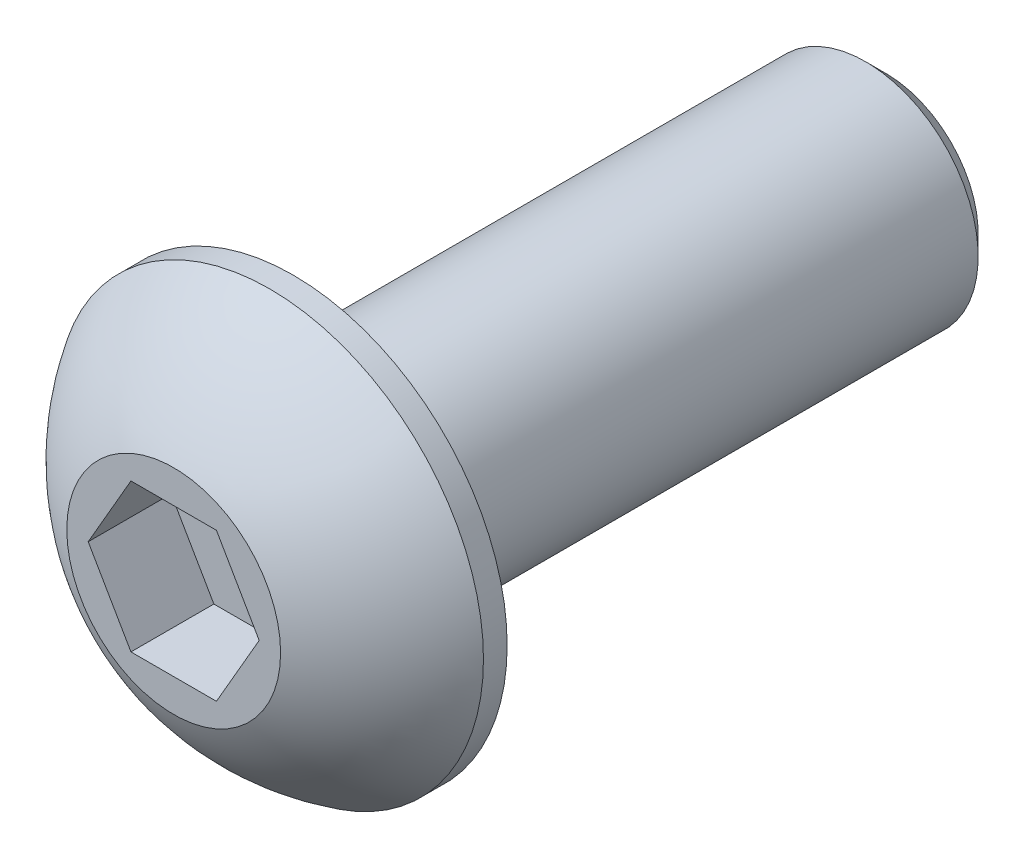
ISO-10303-21;
HEADER;
FILE_DESCRIPTION(('STEP AP214'),'2;1');
FILE_NAME('part.step','',(''),(''),'','','');
FILE_SCHEMA(('AUTOMOTIVE_DESIGN { 1 0 10303 214 1 1 1 1 }'));
ENDSEC;
DATA;
#1=APPLICATION_CONTEXT('core data for automotive mechanical design processes');
#2=APPLICATION_PROTOCOL_DEFINITION('international standard','automotive_design',2000,#1);
#3=PRODUCT_CONTEXT('',#1,'mechanical');
#4=PRODUCT('Part','Part','',(#3));
#5=PRODUCT_RELATED_PRODUCT_CATEGORY('part','',(#4));
#6=PRODUCT_DEFINITION_FORMATION('','',#4);
#7=PRODUCT_DEFINITION_CONTEXT('part definition',#1,'design');
#8=PRODUCT_DEFINITION('design','',#6,#7);
#9=PRODUCT_DEFINITION_SHAPE('','',#8);
#10=(LENGTH_UNIT() NAMED_UNIT(*) SI_UNIT(.MILLI.,.METRE.));
#11=(NAMED_UNIT(*) PLANE_ANGLE_UNIT() SI_UNIT($,.RADIAN.));
#12=(NAMED_UNIT(*) SI_UNIT($,.STERADIAN.) SOLID_ANGLE_UNIT());
#13=UNCERTAINTY_MEASURE_WITH_UNIT(LENGTH_MEASURE(1.E-05),#10,'distance_accuracy_value','');
#14=(GEOMETRIC_REPRESENTATION_CONTEXT(3) GLOBAL_UNCERTAINTY_ASSIGNED_CONTEXT((#13)) GLOBAL_UNIT_ASSIGNED_CONTEXT((#10,
#11,#12)) REPRESENTATION_CONTEXT('',''));
#15=CARTESIAN_POINT('',(0.,0.,0.));
#16=DIRECTION('',(0.,0.,1.));
#17=DIRECTION('',(1.,0.,0.));
#18=AXIS2_PLACEMENT_3D('',#15,#16,#17);
#19=CARTESIAN_POINT('',(0.,0.,2.5654));
#20=DIRECTION('',(0.,0.,1.));
#21=DIRECTION('',(1.,0.,0.));
#22=AXIS2_PLACEMENT_3D('',#19,#20,#21);
#23=PLANE('',#22);
#24=DIRECTION('',(-0.5,0.866025403784439,0.));
#25=VECTOR('',#24,1.);
#26=CARTESIAN_POINT('',(1.3748153285078,0.79375,2.5654));
#27=LINE('',#26,#25);
#28=CARTESIAN_POINT('',(1.83308710467706,0.,2.5654));
#29=VERTEX_POINT('',#28);
#30=CARTESIAN_POINT('',(0.916543552338531,1.5875,2.5654));
#31=VERTEX_POINT('',#30);
#32=EDGE_CURVE('E106',#29,#31,#27,.T.);
#33=ORIENTED_EDGE('',*,*,#32,.F.);
#34=DIRECTION('',(0.5,0.866025403784439,0.));
#35=VECTOR('',#34,1.);
#36=CARTESIAN_POINT('',(1.3748153285078,-0.79375,2.5654));
#37=LINE('',#36,#35);
#38=CARTESIAN_POINT('',(0.91654355233853,-1.5875,2.5654));
#39=VERTEX_POINT('',#38);
#40=EDGE_CURVE('E159',#39,#29,#37,.T.);
#41=ORIENTED_EDGE('',*,*,#40,.F.);
#42=DIRECTION('',(1.,0.,0.));
#43=VECTOR('',#42,1.);
#44=CARTESIAN_POINT('',(0.,-1.5875,2.5654));
#45=LINE('',#44,#43);
#46=CARTESIAN_POINT('',(-0.916543552338531,-1.5875,2.5654));
#47=VERTEX_POINT('',#46);
#48=EDGE_CURVE('E155',#47,#39,#45,.T.);
#49=ORIENTED_EDGE('',*,*,#48,.F.);
#50=DIRECTION('',(0.5,-0.866025403784439,0.));
#51=VECTOR('',#50,1.);
#52=CARTESIAN_POINT('',(-1.3748153285078,-0.79375,2.5654));
#53=LINE('',#52,#51);
#54=CARTESIAN_POINT('',(-1.83308710467706,0.,2.5654));
#55=VERTEX_POINT('',#54);
#56=EDGE_CURVE('E83',#55,#47,#53,.T.);
#57=ORIENTED_EDGE('',*,*,#56,.F.);
#58=DIRECTION('',(-0.5,-0.866025403784439,0.));
#59=VECTOR('',#58,1.);
#60=CARTESIAN_POINT('',(-1.3748153285078,0.79375,2.5654));
#61=LINE('',#60,#59);
#62=CARTESIAN_POINT('',(-0.916543552338531,1.5875,2.5654));
#63=VERTEX_POINT('',#62);
#64=EDGE_CURVE('E78',#63,#55,#61,.T.);
#65=ORIENTED_EDGE('',*,*,#64,.F.);
#66=DIRECTION('',(-1.,0.,0.));
#67=VECTOR('',#66,1.);
#68=CARTESIAN_POINT('',(0.,1.5875,2.5654));
#69=LINE('',#68,#67);
#70=EDGE_CURVE('E86',#31,#63,#69,.T.);
#71=ORIENTED_EDGE('',*,*,#70,.F.);
#72=EDGE_LOOP('',(#33,#41,#49,#57,#65,#71));
#73=FACE_BOUND('',#72,.T.);
#74=CARTESIAN_POINT('',(0.,0.,2.5654));
#75=DIRECTION('',(0.,0.,1.));
#76=DIRECTION('',(1.,0.,0.));
#77=AXIS2_PLACEMENT_3D('',#74,#75,#76);
#78=CIRCLE('',#77,2.29235894204905);
#79=CARTESIAN_POINT('',(2.29235894204904,0.,2.5654));
#80=VERTEX_POINT('',#79);
#81=EDGE_CURVE('E109',#80,#80,#78,.T.);
#82=ORIENTED_EDGE('',*,*,#81,.T.);
#83=EDGE_LOOP('',(#82));
#84=FACE_BOUND('',#83,.T.);
#85=ADVANCED_FACE('F17',(#73,#84),#23,.T.);
#86=CARTESIAN_POINT('',(1.3748153285078,0.79375,0.7874));
#87=DIRECTION('',(0.866025403784439,0.5,0.));
#88=DIRECTION('',(-0.5,0.866025403784439,0.));
#89=AXIS2_PLACEMENT_3D('',#86,#87,#88);
#90=PLANE('',#89);
#91=ORIENTED_EDGE('',*,*,#32,.T.);
#92=DIRECTION('',(0.,0.,1.));
#93=VECTOR('',#92,1.);
#94=CARTESIAN_POINT('',(0.916543552338531,1.5875,0.7874));
#95=LINE('',#94,#93);
#96=CARTESIAN_POINT('',(0.916543552338531,1.5875,0.7874));
#97=VERTEX_POINT('',#96);
#98=EDGE_CURVE('E88',#97,#31,#95,.T.);
#99=ORIENTED_EDGE('',*,*,#98,.F.);
#100=DIRECTION('',(-0.5,0.866025403784439,0.));
#101=VECTOR('',#100,1.);
#102=CARTESIAN_POINT('',(1.3748153285078,0.79375,0.7874));
#103=LINE('',#102,#101);
#104=CARTESIAN_POINT('',(1.83308710467706,0.,0.7874));
#105=VERTEX_POINT('',#104);
#106=EDGE_CURVE('E127',#105,#97,#103,.T.);
#107=ORIENTED_EDGE('',*,*,#106,.F.);
#108=DIRECTION('',(0.,0.,1.));
#109=VECTOR('',#108,1.);
#110=CARTESIAN_POINT('',(1.83308710467706,0.,0.7874));
#111=LINE('',#110,#109);
#112=EDGE_CURVE('E36',#105,#29,#111,.T.);
#113=ORIENTED_EDGE('',*,*,#112,.T.);
#114=EDGE_LOOP('',(#91,#99,#107,#113));
#115=FACE_BOUND('',#114,.T.);
#116=ADVANCED_FACE('F172',(#115),#90,.F.);
#117=CARTESIAN_POINT('',(0.,1.5875,0.7874));
#118=DIRECTION('',(0.,1.,0.));
#119=DIRECTION('',(0.,0.,1.));
#120=AXIS2_PLACEMENT_3D('',#117,#118,#119);
#121=PLANE('',#120);
#122=ORIENTED_EDGE('',*,*,#70,.T.);
#123=DIRECTION('',(0.,0.,1.));
#124=VECTOR('',#123,1.);
#125=CARTESIAN_POINT('',(-0.916543552338531,1.5875,0.7874));
#126=LINE('',#125,#124);
#127=CARTESIAN_POINT('',(-0.916543552338531,1.5875,0.7874));
#128=VERTEX_POINT('',#127);
#129=EDGE_CURVE('E62',#128,#63,#126,.T.);
#130=ORIENTED_EDGE('',*,*,#129,.F.);
#131=DIRECTION('',(-1.,0.,0.));
#132=VECTOR('',#131,1.);
#133=CARTESIAN_POINT('',(0.,1.5875,0.7874));
#134=LINE('',#133,#132);
#135=EDGE_CURVE('E124',#97,#128,#134,.T.);
#136=ORIENTED_EDGE('',*,*,#135,.F.);
#137=ORIENTED_EDGE('',*,*,#98,.T.);
#138=EDGE_LOOP('',(#122,#130,#136,#137));
#139=FACE_BOUND('',#138,.T.);
#140=ADVANCED_FACE('F87',(#139),#121,.F.);
#141=CARTESIAN_POINT('',(-1.3748153285078,0.79375,0.7874));
#142=DIRECTION('',(-0.866025403784439,0.5,0.));
#143=DIRECTION('',(-0.5,-0.866025403784439,0.));
#144=AXIS2_PLACEMENT_3D('',#141,#142,#143);
#145=PLANE('',#144);
#146=ORIENTED_EDGE('',*,*,#64,.T.);
#147=DIRECTION('',(0.,0.,1.));
#148=VECTOR('',#147,1.);
#149=CARTESIAN_POINT('',(-1.83308710467706,0.,0.7874));
#150=LINE('',#149,#148);
#151=CARTESIAN_POINT('',(-1.83308710467706,0.,0.7874));
#152=VERTEX_POINT('',#151);
#153=EDGE_CURVE('E152',#152,#55,#150,.T.);
#154=ORIENTED_EDGE('',*,*,#153,.F.);
#155=DIRECTION('',(-0.5,-0.866025403784439,0.));
#156=VECTOR('',#155,1.);
#157=CARTESIAN_POINT('',(-1.3748153285078,0.79375,0.7874));
#158=LINE('',#157,#156);
#159=EDGE_CURVE('E81',#128,#152,#158,.T.);
#160=ORIENTED_EDGE('',*,*,#159,.F.);
#161=ORIENTED_EDGE('',*,*,#129,.T.);
#162=EDGE_LOOP('',(#146,#154,#160,#161));
#163=FACE_BOUND('',#162,.T.);
#164=ADVANCED_FACE('F76',(#163),#145,.F.);
#165=CARTESIAN_POINT('',(-1.3748153285078,-0.79375,0.7874));
#166=DIRECTION('',(-0.866025403784439,-0.5,0.));
#167=DIRECTION('',(0.5,-0.866025403784439,0.));
#168=AXIS2_PLACEMENT_3D('',#165,#166,#167);
#169=PLANE('',#168);
#170=ORIENTED_EDGE('',*,*,#56,.T.);
#171=DIRECTION('',(0.,0.,1.));
#172=VECTOR('',#171,1.);
#173=CARTESIAN_POINT('',(-0.916543552338531,-1.5875,0.7874));
#174=LINE('',#173,#172);
#175=CARTESIAN_POINT('',(-0.916543552338531,-1.5875,0.7874));
#176=VERTEX_POINT('',#175);
#177=EDGE_CURVE('E156',#176,#47,#174,.T.);
#178=ORIENTED_EDGE('',*,*,#177,.F.);
#179=DIRECTION('',(0.5,-0.866025403784439,0.));
#180=VECTOR('',#179,1.);
#181=CARTESIAN_POINT('',(-1.3748153285078,-0.79375,0.7874));
#182=LINE('',#181,#180);
#183=EDGE_CURVE('E118',#152,#176,#182,.T.);
#184=ORIENTED_EDGE('',*,*,#183,.F.);
#185=ORIENTED_EDGE('',*,*,#153,.T.);
#186=EDGE_LOOP('',(#170,#178,#184,#185));
#187=FACE_BOUND('',#186,.T.);
#188=ADVANCED_FACE('F177',(#187),#169,.F.);
#189=CARTESIAN_POINT('',(0.,-1.5875,0.7874));
#190=DIRECTION('',(0.,-1.,0.));
#191=DIRECTION('',(1.,0.,0.));
#192=AXIS2_PLACEMENT_3D('',#189,#190,#191);
#193=PLANE('',#192);
#194=ORIENTED_EDGE('',*,*,#48,.T.);
#195=DIRECTION('',(0.,0.,1.));
#196=VECTOR('',#195,1.);
#197=CARTESIAN_POINT('',(0.91654355233853,-1.5875,0.7874));
#198=LINE('',#197,#196);
#199=CARTESIAN_POINT('',(0.91654355233853,-1.5875,0.7874));
#200=VERTEX_POINT('',#199);
#201=EDGE_CURVE('E131',#200,#39,#198,.T.);
#202=ORIENTED_EDGE('',*,*,#201,.F.);
#203=DIRECTION('',(1.,0.,0.));
#204=VECTOR('',#203,1.);
#205=CARTESIAN_POINT('',(0.,-1.5875,0.7874));
#206=LINE('',#205,#204);
#207=EDGE_CURVE('E114',#176,#200,#206,.T.);
#208=ORIENTED_EDGE('',*,*,#207,.F.);
#209=ORIENTED_EDGE('',*,*,#177,.T.);
#210=EDGE_LOOP('',(#194,#202,#208,#209));
#211=FACE_BOUND('',#210,.T.);
#212=ADVANCED_FACE('F168',(#211),#193,.F.);
#213=CARTESIAN_POINT('',(1.3748153285078,-0.79375,0.7874));
#214=DIRECTION('',(0.866025403784439,-0.5,0.));
#215=DIRECTION('',(0.5,0.866025403784439,0.));
#216=AXIS2_PLACEMENT_3D('',#213,#214,#215);
#217=PLANE('',#216);
#218=ORIENTED_EDGE('',*,*,#40,.T.);
#219=ORIENTED_EDGE('',*,*,#112,.F.);
#220=DIRECTION('',(0.5,0.866025403784439,0.));
#221=VECTOR('',#220,1.);
#222=CARTESIAN_POINT('',(1.3748153285078,-0.79375,0.7874));
#223=LINE('',#222,#221);
#224=EDGE_CURVE('E110',#200,#105,#223,.T.);
#225=ORIENTED_EDGE('',*,*,#224,.F.);
#226=ORIENTED_EDGE('',*,*,#201,.T.);
#227=EDGE_LOOP('',(#218,#219,#225,#226));
#228=FACE_BOUND('',#227,.T.);
#229=ADVANCED_FACE('F171',(#228),#217,.F.);
#230=CARTESIAN_POINT('',(0.,0.,0.7874));
#231=DIRECTION('',(0.,0.,1.));
#232=DIRECTION('',(1.,0.,0.));
#233=AXIS2_PLACEMENT_3D('',#230,#231,#232);
#234=PLANE('',#233);
#235=ORIENTED_EDGE('',*,*,#106,.T.);
#236=ORIENTED_EDGE('',*,*,#135,.T.);
#237=ORIENTED_EDGE('',*,*,#159,.T.);
#238=ORIENTED_EDGE('',*,*,#183,.T.);
#239=ORIENTED_EDGE('',*,*,#207,.T.);
#240=ORIENTED_EDGE('',*,*,#224,.T.);
#241=EDGE_LOOP('',(#235,#236,#237,#238,#239,#240));
#242=FACE_BOUND('',#241,.T.);
#243=ADVANCED_FACE('F174',(#242),#234,.T.);
#244=CARTESIAN_POINT('',(0.,0.,-2.2944836));
#245=DIRECTION('',(0.,0.,1.));
#246=DIRECTION('',(1.,0.,0.));
#247=AXIS2_PLACEMENT_3D('',#244,#245,#246);
#248=SPHERICAL_SURFACE('',#247,5.3733954);
#249=CARTESIAN_POINT('',(0.,0.,0.507998163498411));
#250=DIRECTION('',(0.,0.,-1.));
#251=DIRECTION('',(-1.,0.,0.));
#252=AXIS2_PLACEMENT_3D('',#249,#250,#251);
#253=CIRCLE('',#252,4.5847);
#254=CARTESIAN_POINT('',(4.5847,0.,0.507998163498411));
#255=VERTEX_POINT('',#254);
#256=EDGE_CURVE('E113',#255,#255,#253,.F.);
#257=CARTESIAN_POINT('',(2.29235894204904,0.,2.5654));
#258=CARTESIAN_POINT('',(2.32179103025388,0.,2.55151721434808));
#259=CARTESIAN_POINT('',(2.35109697394617,0.,2.53736700036662));
#260=CARTESIAN_POINT('',(2.40944696714859,0.,2.508536524447));
#261=CARTESIAN_POINT('',(2.43849101665872,0.,2.49385626250883));
#262=CARTESIAN_POINT('',(2.4963076163397,0.,2.46397049937815));
#263=CARTESIAN_POINT('',(2.52508016651057,0.,2.44876499818564));
#264=CARTESIAN_POINT('',(2.58234427513593,0.,2.41783378550019));
#265=CARTESIAN_POINT('',(2.61083583359044,0.,2.40210807400726));
#266=CARTESIAN_POINT('',(2.66752855294945,0.,2.37014162882497));
#267=CARTESIAN_POINT('',(2.69572971385396,0.,2.35390089513561));
#268=CARTESIAN_POINT('',(2.75183232979709,0.,2.32090976702932));
#269=CARTESIAN_POINT('',(2.77973378483572,0.,2.30415937261238));
#270=CARTESIAN_POINT('',(2.83522777921282,0.,2.27015445184726));
#271=CARTESIAN_POINT('',(2.86282031855129,0.,2.25289992549907));
#272=CARTESIAN_POINT('',(2.91768737378039,0.,2.21789243631376));
#273=CARTESIAN_POINT('',(2.94496188967102,0.,2.20013947347665));
#274=CARTESIAN_POINT('',(2.99918389519827,0.,2.16414097121549));
#275=CARTESIAN_POINT('',(3.02613138483489,0.,2.14589543179145));
#276=CARTESIAN_POINT('',(3.07969044300166,0.,2.10891779886598));
#277=CARTESIAN_POINT('',(3.10630201153182,0.,2.09018570536454));
#278=CARTESIAN_POINT('',(3.1591804435121,0.,2.05224114739138));
#279=CARTESIAN_POINT('',(3.18544730696222,0.,2.03302868291967));
#280=CARTESIAN_POINT('',(3.23762765859007,0.,1.99412972467566));
#281=CARTESIAN_POINT('',(3.2635411467678,0.,1.97444323090337));
#282=CARTESIAN_POINT('',(3.3150061943008,0.,1.93460271219566));
#283=CARTESIAN_POINT('',(3.34055775365607,0.,1.91444868726023));
#284=CARTESIAN_POINT('',(3.39129050945996,0.,1.8736797586869));
#285=CARTESIAN_POINT('',(3.41647170590858,0.,1.853064855049));
#286=CARTESIAN_POINT('',(3.46645542406472,0.,1.8113809736587));
#287=CARTESIAN_POINT('',(3.49125794577225,0.,1.79031199590629));
#288=CARTESIAN_POINT('',(3.5404761276051,0.,1.74772692075615));
#289=CARTESIAN_POINT('',(3.56489178773042,0.,1.72621082335842));
#290=CARTESIAN_POINT('',(3.61332818725341,0.,1.68273861097254));
#291=CARTESIAN_POINT('',(3.63734892665108,0.,1.66078249598438));
#292=CARTESIAN_POINT('',(3.68498755592914,0.,1.61643749571399));
#293=CARTESIAN_POINT('',(3.70860544580953,0.,1.59404861043174));
#294=CARTESIAN_POINT('',(3.75543058023639,0.,1.54884545971876));
#295=CARTESIAN_POINT('',(3.77863782478285,0.,1.52603119428802));
#296=CARTESIAN_POINT('',(3.82463400827142,0.,1.47998481383352));
#297=CARTESIAN_POINT('',(3.84742294721353,0.,1.45675269880978));
#298=CARTESIAN_POINT('',(3.89257499729768,0.,1.40987828764897));
#299=CARTESIAN_POINT('',(3.91493810843971,0.,1.38623599151191));
#300=CARTESIAN_POINT('',(3.95923112128574,0.,1.3385490219972));
#301=CARTESIAN_POINT('',(3.98116102298974,0.,1.31450434861956));
#302=CARTESIAN_POINT('',(4.02458037831562,0.,1.26602056131332));
#303=CARTESIAN_POINT('',(4.04606983193749,0.,1.24158144738472));
#304=CARTESIAN_POINT('',(4.08860119783977,0.,1.19231684586426));
#305=CARTESIAN_POINT('',(4.10964311012016,0.,1.16749135827239));
#306=CARTESIAN_POINT('',(4.15127244780062,0.,1.1174622038449));
#307=CARTESIAN_POINT('',(4.17185987320068,0.,1.09225853700928));
#308=CARTESIAN_POINT('',(4.21257344161545,0.,1.04148134335396));
#309=CARTESIAN_POINT('',(4.23269958463014,0.,1.01590781653428));
#310=CARTESIAN_POINT('',(4.27248394496876,0.,0.96439934421549));
#311=CARTESIAN_POINT('',(4.29214216229267,0.,0.938464398716392));
#312=CARTESIAN_POINT('',(4.33098418262507,0.,0.886241649785618));
#313=CARTESIAN_POINT('',(4.35016798563355,0.,0.859953846353942));
#314=CARTESIAN_POINT('',(4.38805484445696,0.,0.807034058236382));
#315=CARTESIAN_POINT('',(4.40675790027188,0.,0.780402073550498));
#316=CARTESIAN_POINT('',(4.44367709368268,0.,0.726802715226488));
#317=CARTESIAN_POINT('',(4.46189323127856,0.,0.699835341588362));
#318=CARTESIAN_POINT('',(4.49783256612836,0.,0.645574100843897));
#319=CARTESIAN_POINT('',(4.51555576338227,0.,0.618280233737558));
#320=CARTESIAN_POINT('',(4.55050340224788,0.,0.563375037387906));
#321=CARTESIAN_POINT('',(4.56772784385956,0.,0.535763708144593));
#322=CARTESIAN_POINT('',(4.5847,0.,0.507998163498411));
#323=B_SPLINE_CURVE_WITH_KNOTS('',3,(#257,#258,#259,#260,#261,#262,#263,#264,#265,#266,#267,
#268,#269,#270,#271,#272,#273,#274,#275,#276,#277,#278,#279,#280,#281,#282,#283,#284,#285,#286,
#287,#288,#289,#290,#291,#292,#293,#294,#295,#296,#297,#298,#299,#300,#301,#302,#303,#304,#305,
#306,#307,#308,#309,#310,#311,#312,#313,#314,#315,#316,#317,#318,#319,#320,#321,#322),
.UNSPECIFIED.,.F.,.F.,(4,2,2,2,2,2,2,2,2,2,2,2,2,2,2,2,2,2,2,2,2,2,2,2,2,2,2,2,2,2,2,2,4),(0.,
0.0976245535432458,0.195249107086492,0.292873660629738,0.390498214172984,0.48812276771623,
0.585747321259476,0.683371874802722,0.780996428345968,0.878620981889214,0.97624553543246,
1.07387008897571,1.17149464251895,1.2691191960622,1.36674374960544,1.46436830314869,
1.56199285669194,1.65961741023518,1.75724196377843,1.85486651732167,1.95249107086492,
2.05011562440817,2.14774017795141,2.24536473149466,2.3429892850379,2.44061383858115,
2.5382383921244,2.63586294566764,2.73348749921089,2.83111205275413,2.92873660629738,
3.02636115984063,3.12398571338387),.UNSPECIFIED.);
#324=EDGE_CURVE('BSEAM201',#80,#255,#323,.T.);
#325=ORIENTED_EDGE('',*,*,#81,.F.);
#326=ORIENTED_EDGE('',*,*,#256,.T.);
#327=ORIENTED_EDGE('',*,*,#324,.T.);
#328=ORIENTED_EDGE('',*,*,#324,.F.);
#329=EDGE_LOOP('',(#325,#327,#326,#328));
#330=FACE_BOUND('',#329,.T.);
#331=ADVANCED_FACE('F201',(#330),#248,.T.);
#332=CARTESIAN_POINT('',(0.,0.,0.));
#333=DIRECTION('',(0.,0.,1.));
#334=DIRECTION('',(1.,0.,0.));
#335=AXIS2_PLACEMENT_3D('',#332,#333,#334);
#336=PLANE('',#335);
#337=CARTESIAN_POINT('',(0.,0.,0.));
#338=DIRECTION('',(0.,0.,-1.));
#339=DIRECTION('',(-1.,0.,0.));
#340=AXIS2_PLACEMENT_3D('',#337,#338,#339);
#341=CIRCLE('',#340,2.413);
#342=CARTESIAN_POINT('',(-2.413,0.,0.));
#343=VERTEX_POINT('',#342);
#344=EDGE_CURVE('E139',#343,#343,#341,.T.);
#345=ORIENTED_EDGE('',*,*,#344,.F.);
#346=EDGE_LOOP('',(#345));
#347=FACE_BOUND('',#346,.T.);
#348=CARTESIAN_POINT('',(0.,0.,0.));
#349=DIRECTION('',(0.,0.,1.));
#350=DIRECTION('',(1.,0.,0.));
#351=AXIS2_PLACEMENT_3D('',#348,#349,#350);
#352=CIRCLE('',#351,4.5847);
#353=CARTESIAN_POINT('',(4.5847,0.,0.));
#354=VERTEX_POINT('',#353);
#355=EDGE_CURVE('E135',#354,#354,#352,.T.);
#356=ORIENTED_EDGE('',*,*,#355,.F.);
#357=EDGE_LOOP('',(#356));
#358=FACE_BOUND('',#357,.T.);
#359=ADVANCED_FACE('F199',(#347,#358),#336,.F.);
#360=CARTESIAN_POINT('',(0.,0.,2.5654));
#361=DIRECTION('',(0.,0.,-1.));
#362=DIRECTION('',(-1.,0.,0.));
#363=AXIS2_PLACEMENT_3D('',#360,#361,#362);
#364=CYLINDRICAL_SURFACE('',#363,4.5847);
#365=ORIENTED_EDGE('',*,*,#355,.T.);
#366=EDGE_LOOP('',(#365));
#367=FACE_BOUND('',#366,.T.);
#368=ORIENTED_EDGE('',*,*,#256,.F.);
#369=EDGE_LOOP('',(#368));
#370=FACE_BOUND('',#369,.T.);
#371=ADVANCED_FACE('F196',(#367,#370),#364,.T.);
#372=CARTESIAN_POINT('',(0.,0.,-12.7));
#373=DIRECTION('',(0.,0.,1.));
#374=DIRECTION('',(1.,0.,0.));
#375=AXIS2_PLACEMENT_3D('',#372,#373,#374);
#376=CYLINDRICAL_SURFACE('',#375,2.413);
#377=CARTESIAN_POINT('',(0.,0.,-12.2710702));
#378=DIRECTION('',(0.,0.,-1.));
#379=DIRECTION('',(-1.,0.,0.));
#380=AXIS2_PLACEMENT_3D('',#377,#378,#379);
#381=CIRCLE('',#380,2.413);
#382=CARTESIAN_POINT('',(-2.413,0.,-12.2710702));
#383=VERTEX_POINT('',#382);
#384=EDGE_CURVE('E11',#383,#383,#381,.F.);
#385=ORIENTED_EDGE('',*,*,#384,.T.);
#386=EDGE_LOOP('',(#385));
#387=FACE_BOUND('',#386,.T.);
#388=ORIENTED_EDGE('',*,*,#344,.T.);
#389=EDGE_LOOP('',(#388));
#390=FACE_BOUND('',#389,.T.);
#391=ADVANCED_FACE('F198',(#387,#390),#376,.T.);
#392=CARTESIAN_POINT('',(0.,0.,-12.7));
#393=DIRECTION('',(0.,0.,-1.));
#394=DIRECTION('',(1.,0.,0.));
#395=AXIS2_PLACEMENT_3D('',#392,#393,#394);
#396=PLANE('',#395);
#397=CARTESIAN_POINT('',(0.,0.,-12.7));
#398=DIRECTION('',(0.,0.,-1.));
#399=DIRECTION('',(-1.,0.,0.));
#400=AXIS2_PLACEMENT_3D('',#397,#398,#399);
#401=CIRCLE('',#400,1.9840702);
#402=CARTESIAN_POINT('',(-1.9840702,0.,-12.7));
#403=VERTEX_POINT('',#402);
#404=EDGE_CURVE('E28',#403,#403,#401,.T.);
#405=ORIENTED_EDGE('',*,*,#404,.T.);
#406=EDGE_LOOP('',(#405));
#407=FACE_BOUND('',#406,.T.);
#408=ADVANCED_FACE('F259',(#407),#396,.T.);
#409=CARTESIAN_POINT('',(0.,0.,-12.7));
#410=DIRECTION('',(0.,0.,1.));
#411=DIRECTION('',(1.,0.,0.));
#412=AXIS2_PLACEMENT_3D('',#409,#410,#411);
#413=CONICAL_SURFACE('',#412,1.9840702,0.785398163397448);
#414=ORIENTED_EDGE('',*,*,#384,.F.);
#415=EDGE_LOOP('',(#414));
#416=FACE_BOUND('',#415,.T.);
#417=ORIENTED_EDGE('',*,*,#404,.F.);
#418=EDGE_LOOP('',(#417));
#419=FACE_BOUND('',#418,.T.);
#420=ADVANCED_FACE('F20',(#416,#419),#413,.T.);
#421=CLOSED_SHELL('',(#85,#116,#140,#164,#188,#212,#229,#243,#331,#359,#371,#391,#408,#420));
#422=MANIFOLD_SOLID_BREP('B1',#421);
#423=ADVANCED_BREP_SHAPE_REPRESENTATION('',(#18,#422),#14);
#424=SHAPE_DEFINITION_REPRESENTATION(#9,#423);
ENDSEC;
END-ISO-10303-21;
